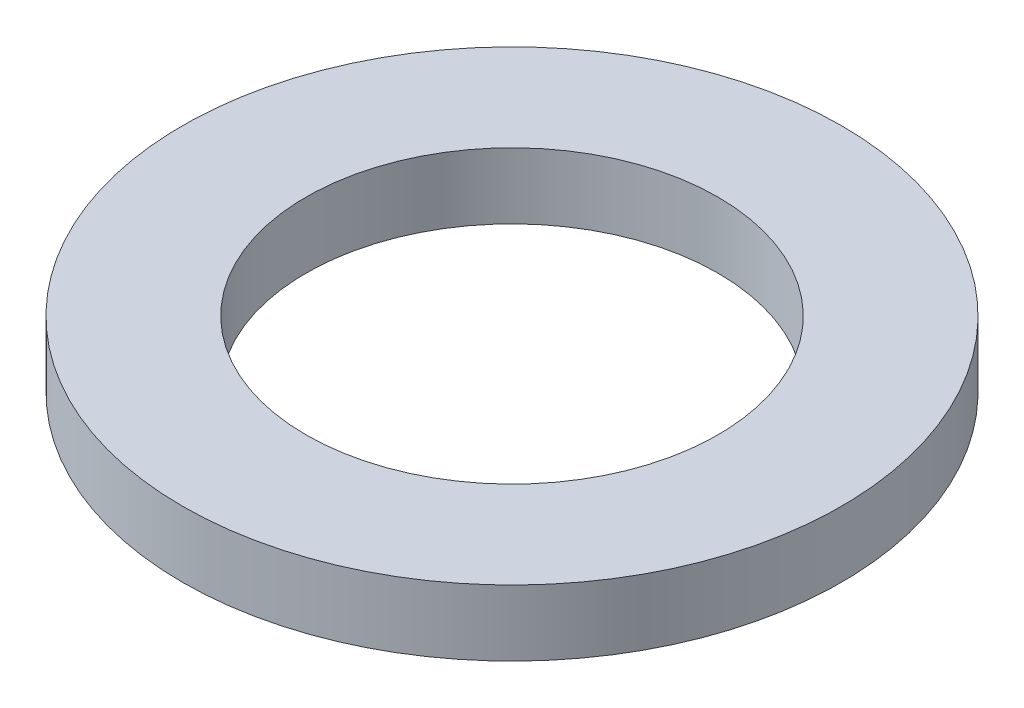
ISO-10303-21;
HEADER;
FILE_DESCRIPTION(('STEP AP214'),'2;1');
FILE_NAME('part.step','',(''),(''),'','','');
FILE_SCHEMA(('AUTOMOTIVE_DESIGN { 1 0 10303 214 1 1 1 1 }'));
ENDSEC;
DATA;
#1=APPLICATION_CONTEXT('core data for automotive mechanical design processes');
#2=APPLICATION_PROTOCOL_DEFINITION('international standard','automotive_design',2000,#1);
#3=PRODUCT_CONTEXT('',#1,'mechanical');
#4=PRODUCT('Part','Part','',(#3));
#5=PRODUCT_RELATED_PRODUCT_CATEGORY('part','',(#4));
#6=PRODUCT_DEFINITION_FORMATION('','',#4);
#7=PRODUCT_DEFINITION_CONTEXT('part definition',#1,'design');
#8=PRODUCT_DEFINITION('design','',#6,#7);
#9=PRODUCT_DEFINITION_SHAPE('','',#8);
#10=(LENGTH_UNIT() NAMED_UNIT(*) SI_UNIT(.MILLI.,.METRE.));
#11=(NAMED_UNIT(*) PLANE_ANGLE_UNIT() SI_UNIT($,.RADIAN.));
#12=(NAMED_UNIT(*) SI_UNIT($,.STERADIAN.) SOLID_ANGLE_UNIT());
#13=UNCERTAINTY_MEASURE_WITH_UNIT(LENGTH_MEASURE(1.E-05),#10,'distance_accuracy_value','');
#14=(GEOMETRIC_REPRESENTATION_CONTEXT(3) GLOBAL_UNCERTAINTY_ASSIGNED_CONTEXT((#13)) GLOBAL_UNIT_ASSIGNED_CONTEXT((#10,
#11,#12)) REPRESENTATION_CONTEXT('',''));
#15=CARTESIAN_POINT('',(0.,0.,0.));
#16=DIRECTION('',(0.,0.,1.));
#17=DIRECTION('',(1.,0.,0.));
#18=AXIS2_PLACEMENT_3D('',#15,#16,#17);
#19=CARTESIAN_POINT('',(0.,0.8,0.));
#20=DIRECTION('',(0.,1.,0.));
#21=DIRECTION('',(0.,0.,1.));
#22=AXIS2_PLACEMENT_3D('',#19,#20,#21);
#23=PLANE('',#22);
#24=CARTESIAN_POINT('',(0.,0.8,0.));
#25=DIRECTION('',(0.,1.,0.));
#26=DIRECTION('',(0.,0.,1.));
#27=AXIS2_PLACEMENT_3D('',#24,#25,#26);
#28=CIRCLE('',#27,4.);
#29=CARTESIAN_POINT('',(0.,0.8,4.));
#30=VERTEX_POINT('',#29);
#31=EDGE_CURVE('E11',#30,#30,#28,.T.);
#32=ORIENTED_EDGE('',*,*,#31,.T.);
#33=EDGE_LOOP('',(#32));
#34=FACE_BOUND('',#33,.T.);
#35=CARTESIAN_POINT('',(0.,0.8,0.));
#36=DIRECTION('',(0.,1.,0.));
#37=DIRECTION('',(0.,0.,1.));
#38=AXIS2_PLACEMENT_3D('',#35,#36,#37);
#39=CIRCLE('',#38,2.5);
#40=CARTESIAN_POINT('',(0.,0.8,2.5));
#41=VERTEX_POINT('',#40);
#42=EDGE_CURVE('E54',#41,#41,#39,.T.);
#43=ORIENTED_EDGE('',*,*,#42,.F.);
#44=EDGE_LOOP('',(#43));
#45=FACE_BOUND('',#44,.T.);
#46=ADVANCED_FACE('F43',(#34,#45),#23,.T.);
#47=CARTESIAN_POINT('',(0.,0.,0.));
#48=DIRECTION('',(0.,1.,0.));
#49=DIRECTION('',(0.,0.,1.));
#50=AXIS2_PLACEMENT_3D('',#47,#48,#49);
#51=PLANE('',#50);
#52=CARTESIAN_POINT('',(0.,0.,0.));
#53=DIRECTION('',(0.,1.,0.));
#54=DIRECTION('',(0.,0.,1.));
#55=AXIS2_PLACEMENT_3D('',#52,#53,#54);
#56=CIRCLE('',#55,4.);
#57=CARTESIAN_POINT('',(0.,0.,4.));
#58=VERTEX_POINT('',#57);
#59=EDGE_CURVE('E47',#58,#58,#56,.T.);
#60=ORIENTED_EDGE('',*,*,#59,.F.);
#61=EDGE_LOOP('',(#60));
#62=FACE_BOUND('',#61,.T.);
#63=CARTESIAN_POINT('',(0.,0.,0.));
#64=DIRECTION('',(0.,1.,0.));
#65=DIRECTION('',(0.,0.,1.));
#66=AXIS2_PLACEMENT_3D('',#63,#64,#65);
#67=CIRCLE('',#66,2.5);
#68=CARTESIAN_POINT('',(0.,0.,2.5));
#69=VERTEX_POINT('',#68);
#70=EDGE_CURVE('E56',#69,#69,#67,.T.);
#71=ORIENTED_EDGE('',*,*,#70,.T.);
#72=EDGE_LOOP('',(#71));
#73=FACE_BOUND('',#72,.T.);
#74=ADVANCED_FACE('F66',(#62,#73),#51,.F.);
#75=CARTESIAN_POINT('',(0.,0.8,0.));
#76=DIRECTION('',(0.,-1.,0.));
#77=DIRECTION('',(0.,0.,-1.));
#78=AXIS2_PLACEMENT_3D('',#75,#76,#77);
#79=CYLINDRICAL_SURFACE('',#78,4.);
#80=ORIENTED_EDGE('',*,*,#31,.F.);
#81=EDGE_LOOP('',(#80));
#82=FACE_BOUND('',#81,.T.);
#83=ORIENTED_EDGE('',*,*,#59,.T.);
#84=EDGE_LOOP('',(#83));
#85=FACE_BOUND('',#84,.T.);
#86=ADVANCED_FACE('F45',(#82,#85),#79,.T.);
#87=CARTESIAN_POINT('',(0.,0.8,0.));
#88=DIRECTION('',(0.,-1.,0.));
#89=DIRECTION('',(0.,0.,-1.));
#90=AXIS2_PLACEMENT_3D('',#87,#88,#89);
#91=CYLINDRICAL_SURFACE('',#90,2.5);
#92=ORIENTED_EDGE('',*,*,#42,.T.);
#93=EDGE_LOOP('',(#92));
#94=FACE_BOUND('',#93,.T.);
#95=ORIENTED_EDGE('',*,*,#70,.F.);
#96=EDGE_LOOP('',(#95));
#97=FACE_BOUND('',#96,.T.);
#98=ADVANCED_FACE('F62',(#94,#97),#91,.F.);
#99=CLOSED_SHELL('',(#46,#74,#86,#98));
#100=MANIFOLD_SOLID_BREP('B2',#99);
#101=ADVANCED_BREP_SHAPE_REPRESENTATION('',(#18,#100),#14);
#102=SHAPE_DEFINITION_REPRESENTATION(#9,#101);
ENDSEC;
END-ISO-10303-21;
